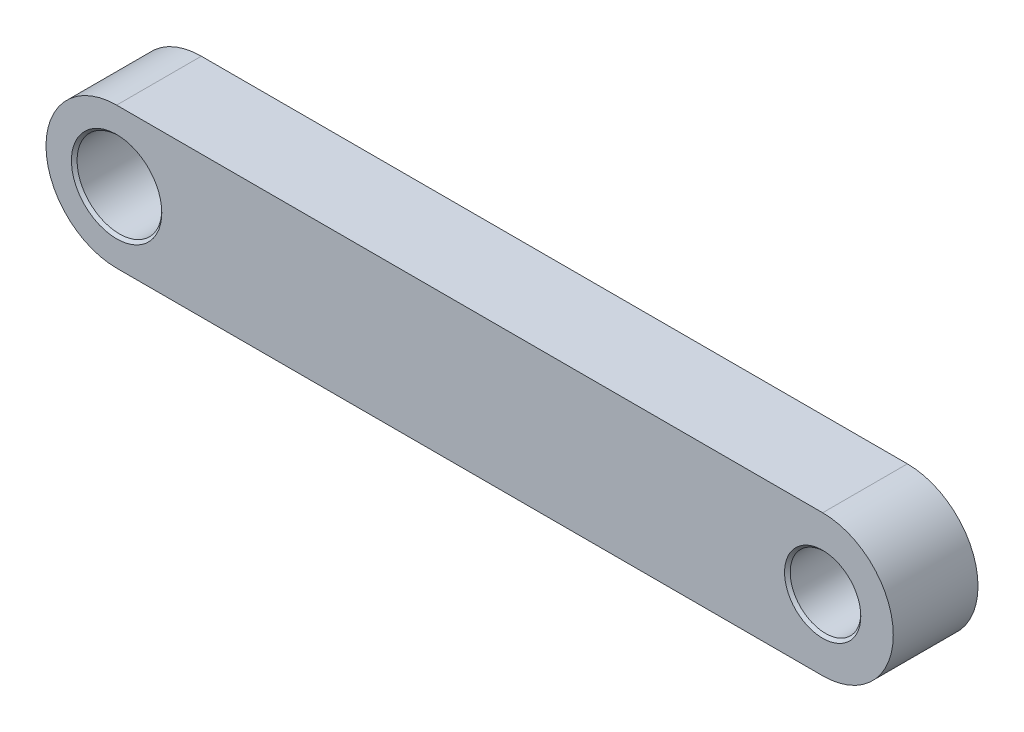
ISO-10303-21;
HEADER;
FILE_DESCRIPTION(('STEP AP214'),'2;1');
FILE_NAME('part.step','',(''),(''),'','','');
FILE_SCHEMA(('AUTOMOTIVE_DESIGN { 1 0 10303 214 1 1 1 1 }'));
ENDSEC;
DATA;
#1=APPLICATION_CONTEXT('core data for automotive mechanical design processes');
#2=APPLICATION_PROTOCOL_DEFINITION('international standard','automotive_design',2000,#1);
#3=PRODUCT_CONTEXT('',#1,'mechanical');
#4=PRODUCT('Part','Part','',(#3));
#5=PRODUCT_RELATED_PRODUCT_CATEGORY('part','',(#4));
#6=PRODUCT_DEFINITION_FORMATION('','',#4);
#7=PRODUCT_DEFINITION_CONTEXT('part definition',#1,'design');
#8=PRODUCT_DEFINITION('design','',#6,#7);
#9=PRODUCT_DEFINITION_SHAPE('','',#8);
#10=(LENGTH_UNIT() NAMED_UNIT(*) SI_UNIT(.MILLI.,.METRE.));
#11=(NAMED_UNIT(*) PLANE_ANGLE_UNIT() SI_UNIT($,.RADIAN.));
#12=(NAMED_UNIT(*) SI_UNIT($,.STERADIAN.) SOLID_ANGLE_UNIT());
#13=UNCERTAINTY_MEASURE_WITH_UNIT(LENGTH_MEASURE(1.E-05),#10,'distance_accuracy_value','');
#14=(GEOMETRIC_REPRESENTATION_CONTEXT(3) GLOBAL_UNCERTAINTY_ASSIGNED_CONTEXT((#13)) GLOBAL_UNIT_ASSIGNED_CONTEXT((#10,
#11,#12)) REPRESENTATION_CONTEXT('',''));
#15=CARTESIAN_POINT('',(0.,0.,0.));
#16=DIRECTION('',(0.,0.,1.));
#17=DIRECTION('',(1.,0.,0.));
#18=AXIS2_PLACEMENT_3D('',#15,#16,#17);
#19=CARTESIAN_POINT('',(0.,0.,3.));
#20=DIRECTION('',(0.,0.,1.));
#21=DIRECTION('',(1.,0.,0.));
#22=AXIS2_PLACEMENT_3D('',#19,#20,#21);
#23=PLANE('',#22);
#24=CARTESIAN_POINT('',(50.,0.,3.));
#25=DIRECTION('',(0.,0.,1.));
#26=DIRECTION('',(1.,0.,0.));
#27=AXIS2_PLACEMENT_3D('',#24,#25,#26);
#28=CIRCLE('',#27,2.69999999999999);
#29=CARTESIAN_POINT('',(52.7,0.,3.));
#30=VERTEX_POINT('',#29);
#31=EDGE_CURVE('E13',#30,#30,#28,.F.);
#32=ORIENTED_EDGE('',*,*,#31,.T.);
#33=EDGE_LOOP('',(#32));
#34=FACE_BOUND('',#33,.T.);
#35=CARTESIAN_POINT('',(0.,0.,3.));
#36=DIRECTION('',(0.,0.,1.));
#37=DIRECTION('',(1.,0.,0.));
#38=AXIS2_PLACEMENT_3D('',#35,#36,#37);
#39=CIRCLE('',#38,3.20000000000001);
#40=CARTESIAN_POINT('',(3.20000000000001,0.,3.));
#41=VERTEX_POINT('',#40);
#42=EDGE_CURVE('E60',#41,#41,#39,.F.);
#43=ORIENTED_EDGE('',*,*,#42,.T.);
#44=EDGE_LOOP('',(#43));
#45=FACE_BOUND('',#44,.T.);
#46=CARTESIAN_POINT('',(0.,0.,3.));
#47=DIRECTION('',(0.,0.,1.));
#48=DIRECTION('',(1.,0.,0.));
#49=AXIS2_PLACEMENT_3D('',#46,#47,#48);
#50=CIRCLE('',#49,5.);
#51=CARTESIAN_POINT('',(0.,5.,3.));
#52=VERTEX_POINT('',#51);
#53=CARTESIAN_POINT('',(0.,-5.,3.));
#54=VERTEX_POINT('',#53);
#55=EDGE_CURVE('E103',#52,#54,#50,.T.);
#56=ORIENTED_EDGE('',*,*,#55,.T.);
#57=DIRECTION('',(1.,0.,0.));
#58=VECTOR('',#57,1.);
#59=CARTESIAN_POINT('',(0.,-5.,3.));
#60=LINE('',#59,#58);
#61=CARTESIAN_POINT('',(50.,-5.,3.));
#62=VERTEX_POINT('',#61);
#63=EDGE_CURVE('E99',#54,#62,#60,.T.);
#64=ORIENTED_EDGE('',*,*,#63,.T.);
#65=CARTESIAN_POINT('',(50.,0.,3.));
#66=DIRECTION('',(0.,0.,1.));
#67=DIRECTION('',(1.,0.,0.));
#68=AXIS2_PLACEMENT_3D('',#65,#66,#67);
#69=CIRCLE('',#68,5.);
#70=CARTESIAN_POINT('',(50.,5.,3.));
#71=VERTEX_POINT('',#70);
#72=EDGE_CURVE('E101',#62,#71,#69,.T.);
#73=ORIENTED_EDGE('',*,*,#72,.T.);
#74=DIRECTION('',(-1.,0.,0.));
#75=VECTOR('',#74,1.);
#76=CARTESIAN_POINT('',(0.,5.,3.));
#77=LINE('',#76,#75);
#78=EDGE_CURVE('E68',#71,#52,#77,.T.);
#79=ORIENTED_EDGE('',*,*,#78,.T.);
#80=EDGE_LOOP('',(#56,#64,#73,#79));
#81=FACE_BOUND('',#80,.T.);
#82=ADVANCED_FACE('F51',(#34,#45,#81),#23,.T.);
#83=CARTESIAN_POINT('',(0.,0.,-3.));
#84=DIRECTION('',(0.,0.,1.));
#85=DIRECTION('',(1.,0.,0.));
#86=AXIS2_PLACEMENT_3D('',#83,#84,#85);
#87=PLANE('',#86);
#88=CARTESIAN_POINT('',(0.,0.,-3.));
#89=DIRECTION('',(0.,0.,1.));
#90=DIRECTION('',(1.,0.,0.));
#91=AXIS2_PLACEMENT_3D('',#88,#89,#90);
#92=CIRCLE('',#91,3.2);
#93=CARTESIAN_POINT('',(-3.2,0.,-3.));
#94=VERTEX_POINT('',#93);
#95=EDGE_CURVE('E130',#94,#94,#92,.T.);
#96=ORIENTED_EDGE('',*,*,#95,.T.);
#97=EDGE_LOOP('',(#96));
#98=FACE_BOUND('',#97,.T.);
#99=CARTESIAN_POINT('',(50.,0.,-3.));
#100=DIRECTION('',(0.,0.,1.));
#101=DIRECTION('',(1.,0.,0.));
#102=AXIS2_PLACEMENT_3D('',#99,#100,#101);
#103=CIRCLE('',#102,2.70000000000001);
#104=CARTESIAN_POINT('',(52.7,0.,-3.));
#105=VERTEX_POINT('',#104);
#106=EDGE_CURVE('E127',#105,#105,#103,.T.);
#107=ORIENTED_EDGE('',*,*,#106,.T.);
#108=EDGE_LOOP('',(#107));
#109=FACE_BOUND('',#108,.T.);
#110=CARTESIAN_POINT('',(0.,0.,-3.));
#111=DIRECTION('',(0.,0.,1.));
#112=DIRECTION('',(1.,0.,0.));
#113=AXIS2_PLACEMENT_3D('',#110,#111,#112);
#114=CIRCLE('',#113,5.);
#115=CARTESIAN_POINT('',(0.,5.,-3.));
#116=VERTEX_POINT('',#115);
#117=CARTESIAN_POINT('',(0.,-5.,-3.));
#118=VERTEX_POINT('',#117);
#119=EDGE_CURVE('E118',#116,#118,#114,.T.);
#120=ORIENTED_EDGE('',*,*,#119,.F.);
#121=DIRECTION('',(-1.,0.,0.));
#122=VECTOR('',#121,1.);
#123=CARTESIAN_POINT('',(0.,5.,-3.));
#124=LINE('',#123,#122);
#125=CARTESIAN_POINT('',(50.,5.,-3.));
#126=VERTEX_POINT('',#125);
#127=EDGE_CURVE('E91',#126,#116,#124,.T.);
#128=ORIENTED_EDGE('',*,*,#127,.F.);
#129=CARTESIAN_POINT('',(50.,0.,-3.));
#130=DIRECTION('',(0.,0.,1.));
#131=DIRECTION('',(1.,0.,0.));
#132=AXIS2_PLACEMENT_3D('',#129,#130,#131);
#133=CIRCLE('',#132,5.);
#134=CARTESIAN_POINT('',(50.,-5.,-3.));
#135=VERTEX_POINT('',#134);
#136=EDGE_CURVE('E85',#135,#126,#133,.T.);
#137=ORIENTED_EDGE('',*,*,#136,.F.);
#138=DIRECTION('',(1.,0.,0.));
#139=VECTOR('',#138,1.);
#140=CARTESIAN_POINT('',(0.,-5.,-3.));
#141=LINE('',#140,#139);
#142=EDGE_CURVE('E108',#118,#135,#141,.T.);
#143=ORIENTED_EDGE('',*,*,#142,.F.);
#144=EDGE_LOOP('',(#120,#128,#137,#143));
#145=FACE_BOUND('',#144,.T.);
#146=ADVANCED_FACE('F170',(#98,#109,#145),#87,.F.);
#147=CARTESIAN_POINT('',(0.,0.,3.));
#148=DIRECTION('',(0.,0.,-1.));
#149=DIRECTION('',(-1.,0.,0.));
#150=AXIS2_PLACEMENT_3D('',#147,#148,#149);
#151=CYLINDRICAL_SURFACE('',#150,5.);
#152=ORIENTED_EDGE('',*,*,#119,.T.);
#153=DIRECTION('',(0.,0.,-1.));
#154=VECTOR('',#153,1.);
#155=CARTESIAN_POINT('',(0.,-5.,3.));
#156=LINE('',#155,#154);
#157=EDGE_CURVE('E109',#54,#118,#156,.T.);
#158=ORIENTED_EDGE('',*,*,#157,.F.);
#159=ORIENTED_EDGE('',*,*,#55,.F.);
#160=DIRECTION('',(0.,0.,-1.));
#161=VECTOR('',#160,1.);
#162=CARTESIAN_POINT('',(0.,5.,3.));
#163=LINE('',#162,#161);
#164=EDGE_CURVE('E114',#52,#116,#163,.T.);
#165=ORIENTED_EDGE('',*,*,#164,.T.);
#166=EDGE_LOOP('',(#152,#158,#159,#165));
#167=FACE_BOUND('',#166,.T.);
#168=ADVANCED_FACE('F176',(#167),#151,.T.);
#169=CARTESIAN_POINT('',(0.,-5.,3.));
#170=DIRECTION('',(0.,1.,0.));
#171=DIRECTION('',(0.,0.,1.));
#172=AXIS2_PLACEMENT_3D('',#169,#170,#171);
#173=PLANE('',#172);
#174=ORIENTED_EDGE('',*,*,#142,.T.);
#175=DIRECTION('',(0.,0.,-1.));
#176=VECTOR('',#175,1.);
#177=CARTESIAN_POINT('',(50.,-5.,3.));
#178=LINE('',#177,#176);
#179=EDGE_CURVE('E106',#62,#135,#178,.T.);
#180=ORIENTED_EDGE('',*,*,#179,.F.);
#181=ORIENTED_EDGE('',*,*,#63,.F.);
#182=ORIENTED_EDGE('',*,*,#157,.T.);
#183=EDGE_LOOP('',(#174,#180,#181,#182));
#184=FACE_BOUND('',#183,.T.);
#185=ADVANCED_FACE('F107',(#184),#173,.F.);
#186=CARTESIAN_POINT('',(50.,0.,3.));
#187=DIRECTION('',(0.,0.,-1.));
#188=DIRECTION('',(-1.,0.,0.));
#189=AXIS2_PLACEMENT_3D('',#186,#187,#188);
#190=CYLINDRICAL_SURFACE('',#189,5.);
#191=ORIENTED_EDGE('',*,*,#136,.T.);
#192=DIRECTION('',(0.,0.,-1.));
#193=VECTOR('',#192,1.);
#194=CARTESIAN_POINT('',(50.,5.,3.));
#195=LINE('',#194,#193);
#196=EDGE_CURVE('E110',#71,#126,#195,.T.);
#197=ORIENTED_EDGE('',*,*,#196,.F.);
#198=ORIENTED_EDGE('',*,*,#72,.F.);
#199=ORIENTED_EDGE('',*,*,#179,.T.);
#200=EDGE_LOOP('',(#191,#197,#198,#199));
#201=FACE_BOUND('',#200,.T.);
#202=ADVANCED_FACE('F112',(#201),#190,.T.);
#203=CARTESIAN_POINT('',(0.,5.,3.));
#204=DIRECTION('',(0.,-1.,0.));
#205=DIRECTION('',(0.,0.,-1.));
#206=AXIS2_PLACEMENT_3D('',#203,#204,#205);
#207=PLANE('',#206);
#208=ORIENTED_EDGE('',*,*,#127,.T.);
#209=ORIENTED_EDGE('',*,*,#164,.F.);
#210=ORIENTED_EDGE('',*,*,#78,.F.);
#211=ORIENTED_EDGE('',*,*,#196,.T.);
#212=EDGE_LOOP('',(#208,#209,#210,#211));
#213=FACE_BOUND('',#212,.T.);
#214=ADVANCED_FACE('F166',(#213),#207,.F.);
#215=CARTESIAN_POINT('',(50.,0.,3.));
#216=DIRECTION('',(0.,0.,-1.));
#217=DIRECTION('',(-1.,0.,0.));
#218=AXIS2_PLACEMENT_3D('',#215,#216,#217);
#219=CYLINDRICAL_SURFACE('',#218,2.5);
#220=CARTESIAN_POINT('',(50.,0.,-2.79999999999999));
#221=DIRECTION('',(0.,0.,1.));
#222=DIRECTION('',(1.,0.,0.));
#223=AXIS2_PLACEMENT_3D('',#220,#221,#222);
#224=CIRCLE('',#223,2.5);
#225=CARTESIAN_POINT('',(52.5,0.,-2.79999999999999));
#226=VERTEX_POINT('',#225);
#227=EDGE_CURVE('E142',#226,#226,#224,.F.);
#228=ORIENTED_EDGE('',*,*,#227,.T.);
#229=EDGE_LOOP('',(#228));
#230=FACE_BOUND('',#229,.T.);
#231=CARTESIAN_POINT('',(50.,0.,2.80000000000002));
#232=DIRECTION('',(0.,0.,1.));
#233=DIRECTION('',(1.,0.,0.));
#234=AXIS2_PLACEMENT_3D('',#231,#232,#233);
#235=CIRCLE('',#234,2.5);
#236=CARTESIAN_POINT('',(52.5,0.,2.80000000000002));
#237=VERTEX_POINT('',#236);
#238=EDGE_CURVE('E139',#237,#237,#235,.T.);
#239=ORIENTED_EDGE('',*,*,#238,.T.);
#240=EDGE_LOOP('',(#239));
#241=FACE_BOUND('',#240,.T.);
#242=ADVANCED_FACE('F156',(#230,#241),#219,.F.);
#243=CARTESIAN_POINT('',(0.,0.,3.));
#244=DIRECTION('',(0.,0.,-1.));
#245=DIRECTION('',(-1.,0.,0.));
#246=AXIS2_PLACEMENT_3D('',#243,#244,#245);
#247=CYLINDRICAL_SURFACE('',#246,3.);
#248=CARTESIAN_POINT('',(0.,0.,-2.8));
#249=DIRECTION('',(0.,0.,1.));
#250=DIRECTION('',(1.,0.,0.));
#251=AXIS2_PLACEMENT_3D('',#248,#249,#250);
#252=CIRCLE('',#251,3.);
#253=CARTESIAN_POINT('',(-3.,0.,-2.8));
#254=VERTEX_POINT('',#253);
#255=EDGE_CURVE('E136',#254,#254,#252,.F.);
#256=CARTESIAN_POINT('',(0.,0.,2.79999999999999));
#257=DIRECTION('',(0.,0.,1.));
#258=DIRECTION('',(1.,0.,0.));
#259=AXIS2_PLACEMENT_3D('',#256,#257,#258);
#260=CIRCLE('',#259,3.);
#261=CARTESIAN_POINT('',(-3.,0.,2.79999999999999));
#262=VERTEX_POINT('',#261);
#263=EDGE_CURVE('E133',#262,#262,#260,.T.);
#264=CARTESIAN_POINT('',(-3.,0.,-2.8));
#265=CARTESIAN_POINT('',(-3.,0.,-2.74166666666666));
#266=CARTESIAN_POINT('',(-3.,0.,-2.68333333333333));
#267=CARTESIAN_POINT('',(-3.,0.,-2.56666666666666));
#268=CARTESIAN_POINT('',(-3.,0.,-2.50833333333333));
#269=CARTESIAN_POINT('',(-3.,0.,-2.39166666666666));
#270=CARTESIAN_POINT('',(-3.,0.,-2.33333333333333));
#271=CARTESIAN_POINT('',(-3.,0.,-2.21666666666666));
#272=CARTESIAN_POINT('',(-3.,0.,-2.15833333333333));
#273=CARTESIAN_POINT('',(-3.,0.,-2.04166666666666));
#274=CARTESIAN_POINT('',(-3.,0.,-1.98333333333333));
#275=CARTESIAN_POINT('',(-3.,0.,-1.86666666666667));
#276=CARTESIAN_POINT('',(-3.,0.,-1.80833333333333));
#277=CARTESIAN_POINT('',(-3.,0.,-1.69166666666667));
#278=CARTESIAN_POINT('',(-3.,0.,-1.63333333333333));
#279=CARTESIAN_POINT('',(-3.,0.,-1.51666666666667));
#280=CARTESIAN_POINT('',(-3.,0.,-1.45833333333333));
#281=CARTESIAN_POINT('',(-3.,0.,-1.34166666666667));
#282=CARTESIAN_POINT('',(-3.,0.,-1.28333333333333));
#283=CARTESIAN_POINT('',(-3.,0.,-1.16666666666667));
#284=CARTESIAN_POINT('',(-3.,0.,-1.10833333333333));
#285=CARTESIAN_POINT('',(-3.,0.,-0.991666666666667));
#286=CARTESIAN_POINT('',(-3.,0.,-0.933333333333334));
#287=CARTESIAN_POINT('',(-3.,0.,-0.816666666666668));
#288=CARTESIAN_POINT('',(-3.,0.,-0.758333333333335));
#289=CARTESIAN_POINT('',(-3.,0.,-0.641666666666668));
#290=CARTESIAN_POINT('',(-3.,0.,-0.583333333333335));
#291=CARTESIAN_POINT('',(-3.,0.,-0.466666666666669));
#292=CARTESIAN_POINT('',(-3.,0.,-0.408333333333336));
#293=CARTESIAN_POINT('',(-3.,0.,-0.291666666666669));
#294=CARTESIAN_POINT('',(-3.,0.,-0.233333333333336));
#295=CARTESIAN_POINT('',(-3.,0.,-0.11666666666667));
#296=CARTESIAN_POINT('',(-3.,0.,-0.0583333333333366));
#297=CARTESIAN_POINT('',(-3.,0.,0.0583333333333296));
#298=CARTESIAN_POINT('',(-3.,0.,0.116666666666663));
#299=CARTESIAN_POINT('',(-3.,0.,0.233333333333329));
#300=CARTESIAN_POINT('',(-3.,0.,0.291666666666662));
#301=CARTESIAN_POINT('',(-3.,0.,0.408333333333329));
#302=CARTESIAN_POINT('',(-3.,0.,0.466666666666662));
#303=CARTESIAN_POINT('',(-3.,0.,0.583333333333328));
#304=CARTESIAN_POINT('',(-3.,0.,0.641666666666662));
#305=CARTESIAN_POINT('',(-3.,0.,0.758333333333328));
#306=CARTESIAN_POINT('',(-3.,0.,0.816666666666661));
#307=CARTESIAN_POINT('',(-3.,0.,0.933333333333327));
#308=CARTESIAN_POINT('',(-3.,0.,0.99166666666666));
#309=CARTESIAN_POINT('',(-3.,0.,1.10833333333333));
#310=CARTESIAN_POINT('',(-3.,0.,1.16666666666666));
#311=CARTESIAN_POINT('',(-3.,0.,1.28333333333333));
#312=CARTESIAN_POINT('',(-3.,0.,1.34166666666666));
#313=CARTESIAN_POINT('',(-3.,0.,1.45833333333333));
#314=CARTESIAN_POINT('',(-3.,0.,1.51666666666666));
#315=CARTESIAN_POINT('',(-3.,0.,1.63333333333333));
#316=CARTESIAN_POINT('',(-3.,0.,1.69166666666666));
#317=CARTESIAN_POINT('',(-3.,0.,1.80833333333333));
#318=CARTESIAN_POINT('',(-3.,0.,1.86666666666666));
#319=CARTESIAN_POINT('',(-3.,0.,1.98333333333332));
#320=CARTESIAN_POINT('',(-3.,0.,2.04166666666666));
#321=CARTESIAN_POINT('',(-3.,0.,2.15833333333332));
#322=CARTESIAN_POINT('',(-3.,0.,2.21666666666666));
#323=CARTESIAN_POINT('',(-3.,0.,2.33333333333332));
#324=CARTESIAN_POINT('',(-3.,0.,2.39166666666666));
#325=CARTESIAN_POINT('',(-3.,0.,2.50833333333332));
#326=CARTESIAN_POINT('',(-3.,0.,2.56666666666666));
#327=CARTESIAN_POINT('',(-3.,0.,2.68333333333332));
#328=CARTESIAN_POINT('',(-3.,0.,2.74166666666666));
#329=CARTESIAN_POINT('',(-3.,0.,2.79999999999999));
#330=B_SPLINE_CURVE_WITH_KNOTS('',3,(#264,#265,#266,#267,#268,#269,#270,#271,#272,#273,#274,
#275,#276,#277,#278,#279,#280,#281,#282,#283,#284,#285,#286,#287,#288,#289,#290,#291,#292,#293,
#294,#295,#296,#297,#298,#299,#300,#301,#302,#303,#304,#305,#306,#307,#308,#309,#310,#311,#312,
#313,#314,#315,#316,#317,#318,#319,#320,#321,#322,#323,#324,#325,#326,#327,#328,#329),
.UNSPECIFIED.,.F.,.F.,(4,2,2,2,2,2,2,2,2,2,2,2,2,2,2,2,2,2,2,2,2,2,2,2,2,2,2,2,2,2,2,2,4),(0.,
0.175,0.349999999999999,0.524999999999999,0.699999999999998,0.874999999999997,1.05,1.225,1.4,
1.575,1.75,1.92499999999999,2.09999999999999,2.27499999999999,2.44999999999999,2.62499999999999,
2.79999999999999,2.97499999999999,3.14999999999999,3.32499999999999,3.49999999999999,
3.67499999999999,3.84999999999999,4.02499999999999,4.19999999999999,4.37499999999999,
4.54999999999999,4.72499999999999,4.89999999999999,5.07499999999999,5.24999999999999,
5.42499999999999,5.59999999999999),.UNSPECIFIED.);
#331=EDGE_CURVE('BSEAM153',#254,#262,#330,.T.);
#332=ORIENTED_EDGE('',*,*,#255,.T.);
#333=ORIENTED_EDGE('',*,*,#263,.T.);
#334=ORIENTED_EDGE('',*,*,#331,.T.);
#335=ORIENTED_EDGE('',*,*,#331,.F.);
#336=EDGE_LOOP('',(#332,#334,#333,#335));
#337=FACE_BOUND('',#336,.T.);
#338=ADVANCED_FACE('F153',(#337),#247,.F.);
#339=CARTESIAN_POINT('',(0.,0.,-3.));
#340=DIRECTION('',(0.,0.,-1.));
#341=DIRECTION('',(-1.,0.,0.));
#342=AXIS2_PLACEMENT_3D('',#339,#340,#341);
#343=CONICAL_SURFACE('',#342,3.2,0.785398163397438);
#344=CARTESIAN_POINT('',(-3.,0.,-2.8));
#345=CARTESIAN_POINT('',(-3.00208333333333,0.,-2.80208333333333));
#346=CARTESIAN_POINT('',(-3.00416666666667,0.,-2.80416666666666));
#347=CARTESIAN_POINT('',(-3.00833333333333,0.,-2.80833333333333));
#348=CARTESIAN_POINT('',(-3.01041666666667,0.,-2.81041666666666));
#349=CARTESIAN_POINT('',(-3.01458333333333,0.,-2.81458333333333));
#350=CARTESIAN_POINT('',(-3.01666666666667,0.,-2.81666666666666));
#351=CARTESIAN_POINT('',(-3.02083333333333,0.,-2.82083333333333));
#352=CARTESIAN_POINT('',(-3.02291666666667,0.,-2.82291666666666));
#353=CARTESIAN_POINT('',(-3.02708333333333,0.,-2.82708333333333));
#354=CARTESIAN_POINT('',(-3.02916666666667,0.,-2.82916666666666));
#355=CARTESIAN_POINT('',(-3.03333333333333,0.,-2.83333333333333));
#356=CARTESIAN_POINT('',(-3.03541666666667,0.,-2.83541666666666));
#357=CARTESIAN_POINT('',(-3.03958333333333,0.,-2.83958333333333));
#358=CARTESIAN_POINT('',(-3.04166666666667,0.,-2.84166666666666));
#359=CARTESIAN_POINT('',(-3.04583333333333,0.,-2.84583333333333));
#360=CARTESIAN_POINT('',(-3.04791666666667,0.,-2.84791666666666));
#361=CARTESIAN_POINT('',(-3.05208333333333,0.,-2.85208333333333));
#362=CARTESIAN_POINT('',(-3.05416666666667,0.,-2.85416666666666));
#363=CARTESIAN_POINT('',(-3.05833333333333,0.,-2.85833333333333));
#364=CARTESIAN_POINT('',(-3.06041666666667,0.,-2.86041666666666));
#365=CARTESIAN_POINT('',(-3.06458333333333,0.,-2.86458333333333));
#366=CARTESIAN_POINT('',(-3.06666666666667,0.,-2.86666666666666));
#367=CARTESIAN_POINT('',(-3.07083333333333,0.,-2.87083333333333));
#368=CARTESIAN_POINT('',(-3.07291666666667,0.,-2.87291666666666));
#369=CARTESIAN_POINT('',(-3.07708333333333,0.,-2.87708333333333));
#370=CARTESIAN_POINT('',(-3.07916666666667,0.,-2.87916666666666));
#371=CARTESIAN_POINT('',(-3.08333333333333,0.,-2.88333333333333));
#372=CARTESIAN_POINT('',(-3.08541666666667,0.,-2.88541666666666));
#373=CARTESIAN_POINT('',(-3.08958333333333,0.,-2.88958333333333));
#374=CARTESIAN_POINT('',(-3.09166666666667,0.,-2.89166666666666));
#375=CARTESIAN_POINT('',(-3.09583333333333,0.,-2.89583333333333));
#376=CARTESIAN_POINT('',(-3.09791666666667,0.,-2.89791666666666));
#377=CARTESIAN_POINT('',(-3.10208333333333,0.,-2.90208333333333));
#378=CARTESIAN_POINT('',(-3.10416666666667,0.,-2.90416666666666));
#379=CARTESIAN_POINT('',(-3.10833333333333,0.,-2.90833333333333));
#380=CARTESIAN_POINT('',(-3.11041666666667,0.,-2.91041666666666));
#381=CARTESIAN_POINT('',(-3.11458333333333,0.,-2.91458333333333));
#382=CARTESIAN_POINT('',(-3.11666666666667,0.,-2.91666666666666));
#383=CARTESIAN_POINT('',(-3.12083333333333,0.,-2.92083333333333));
#384=CARTESIAN_POINT('',(-3.12291666666667,0.,-2.92291666666666));
#385=CARTESIAN_POINT('',(-3.12708333333333,0.,-2.92708333333333));
#386=CARTESIAN_POINT('',(-3.12916666666667,0.,-2.92916666666666));
#387=CARTESIAN_POINT('',(-3.13333333333333,0.,-2.93333333333333));
#388=CARTESIAN_POINT('',(-3.13541666666667,0.,-2.93541666666667));
#389=CARTESIAN_POINT('',(-3.13958333333333,0.,-2.93958333333333));
#390=CARTESIAN_POINT('',(-3.14166666666667,0.,-2.94166666666667));
#391=CARTESIAN_POINT('',(-3.14583333333333,0.,-2.94583333333333));
#392=CARTESIAN_POINT('',(-3.14791666666667,0.,-2.94791666666667));
#393=CARTESIAN_POINT('',(-3.15208333333333,0.,-2.95208333333333));
#394=CARTESIAN_POINT('',(-3.15416666666667,0.,-2.95416666666667));
#395=CARTESIAN_POINT('',(-3.15833333333333,0.,-2.95833333333333));
#396=CARTESIAN_POINT('',(-3.16041666666667,0.,-2.96041666666667));
#397=CARTESIAN_POINT('',(-3.16458333333333,0.,-2.96458333333333));
#398=CARTESIAN_POINT('',(-3.16666666666667,0.,-2.96666666666667));
#399=CARTESIAN_POINT('',(-3.17083333333333,0.,-2.97083333333333));
#400=CARTESIAN_POINT('',(-3.17291666666667,0.,-2.97291666666667));
#401=CARTESIAN_POINT('',(-3.17708333333333,0.,-2.97708333333333));
#402=CARTESIAN_POINT('',(-3.17916666666667,0.,-2.97916666666667));
#403=CARTESIAN_POINT('',(-3.18333333333333,0.,-2.98333333333333));
#404=CARTESIAN_POINT('',(-3.18541666666667,0.,-2.98541666666667));
#405=CARTESIAN_POINT('',(-3.18958333333333,0.,-2.98958333333333));
#406=CARTESIAN_POINT('',(-3.19166666666667,0.,-2.99166666666667));
#407=CARTESIAN_POINT('',(-3.19583333333333,0.,-2.99583333333333));
#408=CARTESIAN_POINT('',(-3.19791666666667,0.,-2.99791666666667));
#409=CARTESIAN_POINT('',(-3.2,0.,-3.));
#410=B_SPLINE_CURVE_WITH_KNOTS('',3,(#344,#345,#346,#347,#348,#349,#350,#351,#352,#353,#354,
#355,#356,#357,#358,#359,#360,#361,#362,#363,#364,#365,#366,#367,#368,#369,#370,#371,#372,#373,
#374,#375,#376,#377,#378,#379,#380,#381,#382,#383,#384,#385,#386,#387,#388,#389,#390,#391,#392,
#393,#394,#395,#396,#397,#398,#399,#400,#401,#402,#403,#404,#405,#406,#407,#408,#409),
.UNSPECIFIED.,.F.,.F.,(4,2,2,2,2,2,2,2,2,2,2,2,2,2,2,2,2,2,2,2,2,2,2,2,2,2,2,2,2,2,2,2,4),(0.,
0.00883883476483148,0.0176776695296636,0.0265165042944954,0.0353553390593275,0.0441941738241596,
0.0530330085889914,0.0618718433538235,0.0707106781186552,0.0795495128834873,0.0883883476483194,
0.0972271824131512,0.106066017177983,0.114904851942815,0.123743686707647,0.132582521472479,
0.141421356237311,0.150260191002143,0.159099025766975,0.167937860531807,0.176776695296639,
0.185615530061471,0.194454364826303,0.203293199591135,0.212132034355967,0.220970869120799,
0.229809703885631,0.238648538650463,0.247487373415295,0.256326208180127,0.265165042944959,
0.274003877709791,0.282842712474622),.UNSPECIFIED.);
#411=EDGE_CURVE('BSEAM155',#254,#94,#410,.T.);
#412=ORIENTED_EDGE('',*,*,#255,.F.);
#413=ORIENTED_EDGE('',*,*,#95,.F.);
#414=ORIENTED_EDGE('',*,*,#411,.T.);
#415=ORIENTED_EDGE('',*,*,#411,.F.);
#416=EDGE_LOOP('',(#412,#414,#413,#415));
#417=FACE_BOUND('',#416,.T.);
#418=ADVANCED_FACE('F155',(#417),#343,.F.);
#419=CARTESIAN_POINT('',(50.,0.,-3.));
#420=DIRECTION('',(0.,0.,-1.));
#421=DIRECTION('',(-1.,0.,0.));
#422=AXIS2_PLACEMENT_3D('',#419,#420,#421);
#423=CONICAL_SURFACE('',#422,2.70000000000001,0.785398163397444);
#424=ORIENTED_EDGE('',*,*,#227,.F.);
#425=EDGE_LOOP('',(#424));
#426=FACE_BOUND('',#425,.T.);
#427=ORIENTED_EDGE('',*,*,#106,.F.);
#428=EDGE_LOOP('',(#427));
#429=FACE_BOUND('',#428,.T.);
#430=ADVANCED_FACE('F163',(#426,#429),#423,.F.);
#431=CARTESIAN_POINT('',(50.,0.,2.80000000000002));
#432=DIRECTION('',(0.,0.,1.));
#433=DIRECTION('',(1.,0.,0.));
#434=AXIS2_PLACEMENT_3D('',#431,#432,#433);
#435=CONICAL_SURFACE('',#434,2.5,0.785398163397449);
#436=ORIENTED_EDGE('',*,*,#31,.F.);
#437=EDGE_LOOP('',(#436));
#438=FACE_BOUND('',#437,.T.);
#439=ORIENTED_EDGE('',*,*,#238,.F.);
#440=EDGE_LOOP('',(#439));
#441=FACE_BOUND('',#440,.T.);
#442=ADVANCED_FACE('F150',(#438,#441),#435,.F.);
#443=CARTESIAN_POINT('',(0.,0.,2.79999999999999));
#444=DIRECTION('',(0.,0.,1.));
#445=DIRECTION('',(1.,0.,0.));
#446=AXIS2_PLACEMENT_3D('',#443,#444,#445);
#447=CONICAL_SURFACE('',#446,3.,0.785398163397442);
#448=ORIENTED_EDGE('',*,*,#42,.F.);
#449=EDGE_LOOP('',(#448));
#450=FACE_BOUND('',#449,.T.);
#451=ORIENTED_EDGE('',*,*,#263,.F.);
#452=EDGE_LOOP('',(#451));
#453=FACE_BOUND('',#452,.T.);
#454=ADVANCED_FACE('F53',(#450,#453),#447,.F.);
#455=CLOSED_SHELL('',(#82,#146,#168,#185,#202,#214,#242,#338,#418,#430,#442,#454));
#456=MANIFOLD_SOLID_BREP('B2',#455);
#457=ADVANCED_BREP_SHAPE_REPRESENTATION('',(#18,#456),#14);
#458=SHAPE_DEFINITION_REPRESENTATION(#9,#457);
ENDSEC;
END-ISO-10303-21;
